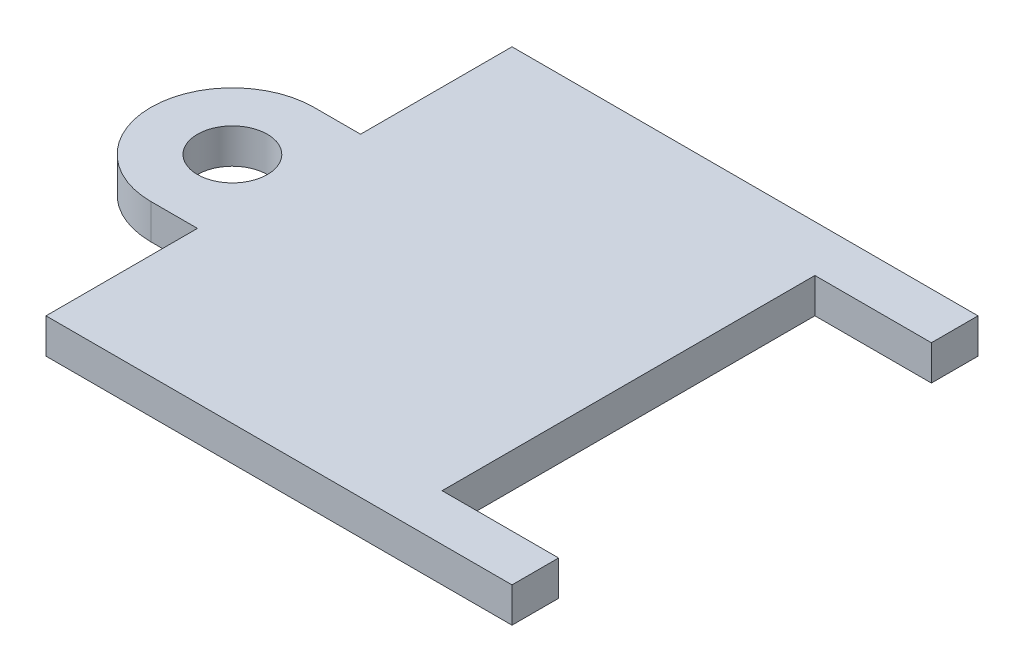
ISO-10303-21;
HEADER;
FILE_DESCRIPTION(('STEP AP214'),'2;1');
FILE_NAME('part.step','',(''),(''),'','','');
FILE_SCHEMA(('AUTOMOTIVE_DESIGN { 1 0 10303 214 1 1 1 1 }'));
ENDSEC;
DATA;
#1=APPLICATION_CONTEXT('core data for automotive mechanical design processes');
#2=APPLICATION_PROTOCOL_DEFINITION('international standard','automotive_design',2000,#1);
#3=PRODUCT_CONTEXT('',#1,'mechanical');
#4=PRODUCT('Part','Part','',(#3));
#5=PRODUCT_RELATED_PRODUCT_CATEGORY('part','',(#4));
#6=PRODUCT_DEFINITION_FORMATION('','',#4);
#7=PRODUCT_DEFINITION_CONTEXT('part definition',#1,'design');
#8=PRODUCT_DEFINITION('design','',#6,#7);
#9=PRODUCT_DEFINITION_SHAPE('','',#8);
#10=(LENGTH_UNIT() NAMED_UNIT(*) SI_UNIT(.MILLI.,.METRE.));
#11=(NAMED_UNIT(*) PLANE_ANGLE_UNIT() SI_UNIT($,.RADIAN.));
#12=(NAMED_UNIT(*) SI_UNIT($,.STERADIAN.) SOLID_ANGLE_UNIT());
#13=UNCERTAINTY_MEASURE_WITH_UNIT(LENGTH_MEASURE(1.E-05),#10,'distance_accuracy_value','');
#14=(GEOMETRIC_REPRESENTATION_CONTEXT(3) GLOBAL_UNCERTAINTY_ASSIGNED_CONTEXT((#13)) GLOBAL_UNIT_ASSIGNED_CONTEXT((#10,
#11,#12)) REPRESENTATION_CONTEXT('',''));
#15=CARTESIAN_POINT('',(0.,0.,0.));
#16=DIRECTION('',(0.,0.,1.));
#17=DIRECTION('',(1.,0.,0.));
#18=AXIS2_PLACEMENT_3D('',#15,#16,#17);
#19=CARTESIAN_POINT('',(-2.,0.,-10.));
#20=DIRECTION('',(0.,1.,0.));
#21=DIRECTION('',(0.,0.,1.));
#22=AXIS2_PLACEMENT_3D('',#19,#20,#21);
#23=PLANE('',#22);
#24=CARTESIAN_POINT('',(-2.,0.,-10.));
#25=DIRECTION('',(0.,1.,0.));
#26=DIRECTION('',(0.,0.,1.));
#27=AXIS2_PLACEMENT_3D('',#24,#25,#26);
#28=CIRCLE('',#27,1.5);
#29=CARTESIAN_POINT('',(-2.,0.,-8.5));
#30=VERTEX_POINT('',#29);
#31=EDGE_CURVE('E176',#30,#30,#28,.T.);
#32=ORIENTED_EDGE('',*,*,#31,.T.);
#33=EDGE_LOOP('',(#32));
#34=FACE_BOUND('',#33,.T.);
#35=DIRECTION('',(0.,0.,1.));
#36=VECTOR('',#35,1.);
#37=CARTESIAN_POINT('',(0.,0.,0.));
#38=LINE('',#37,#36);
#39=CARTESIAN_POINT('',(0.,0.,-6.5));
#40=VERTEX_POINT('',#39);
#41=CARTESIAN_POINT('',(0.,0.,0.));
#42=VERTEX_POINT('',#41);
#43=EDGE_CURVE('E189',#40,#42,#38,.T.);
#44=ORIENTED_EDGE('',*,*,#43,.F.);
#45=DIRECTION('',(1.,0.,0.));
#46=VECTOR('',#45,1.);
#47=CARTESIAN_POINT('',(-2.,0.,-6.5));
#48=LINE('',#47,#46);
#49=CARTESIAN_POINT('',(-2.,0.,-6.5));
#50=VERTEX_POINT('',#49);
#51=EDGE_CURVE('E196',#50,#40,#48,.T.);
#52=ORIENTED_EDGE('',*,*,#51,.F.);
#53=CARTESIAN_POINT('',(-2.,0.,-10.));
#54=DIRECTION('',(0.,1.,0.));
#55=DIRECTION('',(0.,0.,1.));
#56=AXIS2_PLACEMENT_3D('',#53,#54,#55);
#57=CIRCLE('',#56,3.5);
#58=CARTESIAN_POINT('',(-2.,0.,-13.5));
#59=VERTEX_POINT('',#58);
#60=EDGE_CURVE('E261',#59,#50,#57,.T.);
#61=ORIENTED_EDGE('',*,*,#60,.F.);
#62=DIRECTION('',(-1.,0.,0.));
#63=VECTOR('',#62,1.);
#64=CARTESIAN_POINT('',(-2.,0.,-13.5));
#65=LINE('',#64,#63);
#66=CARTESIAN_POINT('',(0.,0.,-13.5));
#67=VERTEX_POINT('',#66);
#68=EDGE_CURVE('E258',#67,#59,#65,.T.);
#69=ORIENTED_EDGE('',*,*,#68,.F.);
#70=DIRECTION('',(0.,0.,1.));
#71=VECTOR('',#70,1.);
#72=CARTESIAN_POINT('',(0.,0.,-13.5));
#73=LINE('',#72,#71);
#74=CARTESIAN_POINT('',(0.,0.,-20.));
#75=VERTEX_POINT('',#74);
#76=EDGE_CURVE('E255',#75,#67,#73,.T.);
#77=ORIENTED_EDGE('',*,*,#76,.F.);
#78=DIRECTION('',(-1.,0.,0.));
#79=VECTOR('',#78,1.);
#80=CARTESIAN_POINT('',(0.,0.,-20.));
#81=LINE('',#80,#79);
#82=CARTESIAN_POINT('',(20.,0.,-20.));
#83=VERTEX_POINT('',#82);
#84=EDGE_CURVE('E252',#83,#75,#81,.T.);
#85=ORIENTED_EDGE('',*,*,#84,.F.);
#86=DIRECTION('',(0.,0.,-1.));
#87=VECTOR('',#86,1.);
#88=CARTESIAN_POINT('',(20.,0.,-20.));
#89=LINE('',#88,#87);
#90=CARTESIAN_POINT('',(20.,0.,-18.));
#91=VERTEX_POINT('',#90);
#92=EDGE_CURVE('E248',#91,#83,#89,.T.);
#93=ORIENTED_EDGE('',*,*,#92,.F.);
#94=DIRECTION('',(1.,0.,0.));
#95=VECTOR('',#94,1.);
#96=CARTESIAN_POINT('',(20.,0.,-18.));
#97=LINE('',#96,#95);
#98=CARTESIAN_POINT('',(15.,0.,-18.));
#99=VERTEX_POINT('',#98);
#100=EDGE_CURVE('E245',#99,#91,#97,.T.);
#101=ORIENTED_EDGE('',*,*,#100,.F.);
#102=DIRECTION('',(0.,0.,-1.));
#103=VECTOR('',#102,1.);
#104=CARTESIAN_POINT('',(15.,0.,-18.));
#105=LINE('',#104,#103);
#106=CARTESIAN_POINT('',(15.,0.,-2.));
#107=VERTEX_POINT('',#106);
#108=EDGE_CURVE('E242',#107,#99,#105,.T.);
#109=ORIENTED_EDGE('',*,*,#108,.F.);
#110=DIRECTION('',(-1.,0.,0.));
#111=VECTOR('',#110,1.);
#112=CARTESIAN_POINT('',(20.,0.,-2.));
#113=LINE('',#112,#111);
#114=CARTESIAN_POINT('',(20.,0.,-2.));
#115=VERTEX_POINT('',#114);
#116=EDGE_CURVE('E239',#115,#107,#113,.T.);
#117=ORIENTED_EDGE('',*,*,#116,.F.);
#118=DIRECTION('',(0.,0.,-1.));
#119=VECTOR('',#118,1.);
#120=CARTESIAN_POINT('',(20.,0.,0.));
#121=LINE('',#120,#119);
#122=CARTESIAN_POINT('',(20.,0.,0.));
#123=VERTEX_POINT('',#122);
#124=EDGE_CURVE('E236',#123,#115,#121,.T.);
#125=ORIENTED_EDGE('',*,*,#124,.F.);
#126=DIRECTION('',(1.,0.,0.));
#127=VECTOR('',#126,1.);
#128=CARTESIAN_POINT('',(15.,0.,0.));
#129=LINE('',#128,#127);
#130=EDGE_CURVE('E233',#42,#123,#129,.T.);
#131=ORIENTED_EDGE('',*,*,#130,.F.);
#132=EDGE_LOOP('',(#44,#52,#61,#69,#77,#85,#93,#101,#109,#117,#125,#131));
#133=FACE_BOUND('',#132,.T.);
#134=DIRECTION('',(0.,0.,-1.));
#135=VECTOR('',#134,1.);
#136=CARTESIAN_POINT('',(2.2,0.,-2.2));
#137=LINE('',#136,#135);
#138=CARTESIAN_POINT('',(2.2,0.,-2.2));
#139=VERTEX_POINT('',#138);
#140=CARTESIAN_POINT('',(2.2,0.,-17.8));
#141=VERTEX_POINT('',#140);
#142=EDGE_CURVE('E55',#139,#141,#137,.T.);
#143=ORIENTED_EDGE('',*,*,#142,.F.);
#144=DIRECTION('',(-1.,0.,0.));
#145=VECTOR('',#144,1.);
#146=CARTESIAN_POINT('',(2.2,0.,-2.2));
#147=LINE('',#146,#145);
#148=CARTESIAN_POINT('',(12.8,0.,-2.2));
#149=VERTEX_POINT('',#148);
#150=EDGE_CURVE('E59',#149,#139,#147,.T.);
#151=ORIENTED_EDGE('',*,*,#150,.F.);
#152=DIRECTION('',(0.,0.,1.));
#153=VECTOR('',#152,1.);
#154=CARTESIAN_POINT('',(12.8,0.,-2.2));
#155=LINE('',#154,#153);
#156=CARTESIAN_POINT('',(12.8,0.,-17.8));
#157=VERTEX_POINT('',#156);
#158=EDGE_CURVE('E541',#157,#149,#155,.T.);
#159=ORIENTED_EDGE('',*,*,#158,.F.);
#160=DIRECTION('',(1.,0.,0.));
#161=VECTOR('',#160,1.);
#162=CARTESIAN_POINT('',(12.8,0.,-17.8));
#163=LINE('',#162,#161);
#164=EDGE_CURVE('E551',#141,#157,#163,.T.);
#165=ORIENTED_EDGE('',*,*,#164,.F.);
#166=EDGE_LOOP('',(#143,#151,#159,#165));
#167=FACE_BOUND('',#166,.T.);
#168=ADVANCED_FACE('F39',(#34,#133,#167),#23,.F.);
#169=CARTESIAN_POINT('',(-2.,1.5,-10.));
#170=DIRECTION('',(0.,1.,0.));
#171=DIRECTION('',(0.,0.,1.));
#172=AXIS2_PLACEMENT_3D('',#169,#170,#171);
#173=PLANE('',#172);
#174=DIRECTION('',(0.,0.,1.));
#175=VECTOR('',#174,1.);
#176=CARTESIAN_POINT('',(0.,1.5,0.));
#177=LINE('',#176,#175);
#178=CARTESIAN_POINT('',(0.,1.5,-6.5));
#179=VERTEX_POINT('',#178);
#180=CARTESIAN_POINT('',(0.,1.5,0.));
#181=VERTEX_POINT('',#180);
#182=EDGE_CURVE('E191',#179,#181,#177,.T.);
#183=ORIENTED_EDGE('',*,*,#182,.T.);
#184=DIRECTION('',(1.,0.,0.));
#185=VECTOR('',#184,1.);
#186=CARTESIAN_POINT('',(0.,1.5,0.));
#187=LINE('',#186,#185);
#188=CARTESIAN_POINT('',(20.,1.5,0.));
#189=VERTEX_POINT('',#188);
#190=EDGE_CURVE('E195',#181,#189,#187,.T.);
#191=ORIENTED_EDGE('',*,*,#190,.T.);
#192=DIRECTION('',(0.,0.,-1.));
#193=VECTOR('',#192,1.);
#194=CARTESIAN_POINT('',(20.,1.5,0.));
#195=LINE('',#194,#193);
#196=CARTESIAN_POINT('',(20.,1.5,-2.));
#197=VERTEX_POINT('',#196);
#198=EDGE_CURVE('E199',#189,#197,#195,.T.);
#199=ORIENTED_EDGE('',*,*,#198,.T.);
#200=DIRECTION('',(-1.,0.,0.));
#201=VECTOR('',#200,1.);
#202=CARTESIAN_POINT('',(20.,1.5,-2.));
#203=LINE('',#202,#201);
#204=CARTESIAN_POINT('',(15.,1.5,-2.));
#205=VERTEX_POINT('',#204);
#206=EDGE_CURVE('E202',#197,#205,#203,.T.);
#207=ORIENTED_EDGE('',*,*,#206,.T.);
#208=DIRECTION('',(0.,0.,-1.));
#209=VECTOR('',#208,1.);
#210=CARTESIAN_POINT('',(15.,1.5,-18.));
#211=LINE('',#210,#209);
#212=CARTESIAN_POINT('',(15.,1.5,-18.));
#213=VERTEX_POINT('',#212);
#214=EDGE_CURVE('E205',#205,#213,#211,.T.);
#215=ORIENTED_EDGE('',*,*,#214,.T.);
#216=DIRECTION('',(1.,0.,0.));
#217=VECTOR('',#216,1.);
#218=CARTESIAN_POINT('',(20.,1.5,-18.));
#219=LINE('',#218,#217);
#220=CARTESIAN_POINT('',(20.,1.5,-18.));
#221=VERTEX_POINT('',#220);
#222=EDGE_CURVE('E208',#213,#221,#219,.T.);
#223=ORIENTED_EDGE('',*,*,#222,.T.);
#224=DIRECTION('',(0.,0.,-1.));
#225=VECTOR('',#224,1.);
#226=CARTESIAN_POINT('',(20.,1.5,-20.));
#227=LINE('',#226,#225);
#228=CARTESIAN_POINT('',(20.,1.5,-20.));
#229=VERTEX_POINT('',#228);
#230=EDGE_CURVE('E211',#221,#229,#227,.T.);
#231=ORIENTED_EDGE('',*,*,#230,.T.);
#232=DIRECTION('',(-1.,0.,0.));
#233=VECTOR('',#232,1.);
#234=CARTESIAN_POINT('',(15.,1.5,-20.));
#235=LINE('',#234,#233);
#236=CARTESIAN_POINT('',(0.,1.5,-20.));
#237=VERTEX_POINT('',#236);
#238=EDGE_CURVE('E214',#229,#237,#235,.T.);
#239=ORIENTED_EDGE('',*,*,#238,.T.);
#240=DIRECTION('',(0.,0.,1.));
#241=VECTOR('',#240,1.);
#242=CARTESIAN_POINT('',(0.,1.5,-13.5));
#243=LINE('',#242,#241);
#244=CARTESIAN_POINT('',(0.,1.5,-13.5));
#245=VERTEX_POINT('',#244);
#246=EDGE_CURVE('E217',#237,#245,#243,.T.);
#247=ORIENTED_EDGE('',*,*,#246,.T.);
#248=DIRECTION('',(-1.,0.,0.));
#249=VECTOR('',#248,1.);
#250=CARTESIAN_POINT('',(-2.,1.5,-13.5));
#251=LINE('',#250,#249);
#252=CARTESIAN_POINT('',(-2.,1.5,-13.5));
#253=VERTEX_POINT('',#252);
#254=EDGE_CURVE('E220',#245,#253,#251,.T.);
#255=ORIENTED_EDGE('',*,*,#254,.T.);
#256=CARTESIAN_POINT('',(-2.,1.5,-10.));
#257=DIRECTION('',(0.,1.,0.));
#258=DIRECTION('',(0.,0.,1.));
#259=AXIS2_PLACEMENT_3D('',#256,#257,#258);
#260=CIRCLE('',#259,3.5);
#261=CARTESIAN_POINT('',(-2.,1.5,-6.5));
#262=VERTEX_POINT('',#261);
#263=EDGE_CURVE('E223',#253,#262,#260,.T.);
#264=ORIENTED_EDGE('',*,*,#263,.T.);
#265=DIRECTION('',(1.,0.,0.));
#266=VECTOR('',#265,1.);
#267=CARTESIAN_POINT('',(-2.,1.5,-6.5));
#268=LINE('',#267,#266);
#269=EDGE_CURVE('E226',#262,#179,#268,.T.);
#270=ORIENTED_EDGE('',*,*,#269,.T.);
#271=EDGE_LOOP('',(#183,#191,#199,#207,#215,#223,#231,#239,#247,#255,#264,#270));
#272=FACE_BOUND('',#271,.T.);
#273=CARTESIAN_POINT('',(-2.,1.5,-10.));
#274=DIRECTION('',(0.,1.,0.));
#275=DIRECTION('',(0.,0.,1.));
#276=AXIS2_PLACEMENT_3D('',#273,#274,#275);
#277=CIRCLE('',#276,1.5);
#278=CARTESIAN_POINT('',(-2.,1.5,-8.5));
#279=VERTEX_POINT('',#278);
#280=EDGE_CURVE('E181',#279,#279,#277,.T.);
#281=ORIENTED_EDGE('',*,*,#280,.F.);
#282=EDGE_LOOP('',(#281));
#283=FACE_BOUND('',#282,.T.);
#284=ADVANCED_FACE('F328',(#272,#283),#173,.T.);
#285=CARTESIAN_POINT('',(0.,1.5,0.));
#286=DIRECTION('',(1.,0.,0.));
#287=DIRECTION('',(0.,0.,-1.));
#288=AXIS2_PLACEMENT_3D('',#285,#286,#287);
#289=PLANE('',#288);
#290=ORIENTED_EDGE('',*,*,#43,.T.);
#291=DIRECTION('',(0.,-1.,0.));
#292=VECTOR('',#291,1.);
#293=CARTESIAN_POINT('',(0.,1.5,0.));
#294=LINE('',#293,#292);
#295=EDGE_CURVE('E11',#181,#42,#294,.T.);
#296=ORIENTED_EDGE('',*,*,#295,.F.);
#297=ORIENTED_EDGE('',*,*,#182,.F.);
#298=DIRECTION('',(0.,-1.,0.));
#299=VECTOR('',#298,1.);
#300=CARTESIAN_POINT('',(0.,1.5,-6.5));
#301=LINE('',#300,#299);
#302=EDGE_CURVE('E229',#179,#40,#301,.T.);
#303=ORIENTED_EDGE('',*,*,#302,.T.);
#304=EDGE_LOOP('',(#290,#296,#297,#303));
#305=FACE_BOUND('',#304,.T.);
#306=ADVANCED_FACE('F41',(#305),#289,.F.);
#307=CARTESIAN_POINT('',(15.,1.5,0.));
#308=DIRECTION('',(0.,0.,-1.));
#309=DIRECTION('',(-1.,0.,0.));
#310=AXIS2_PLACEMENT_3D('',#307,#308,#309);
#311=PLANE('',#310);
#312=ORIENTED_EDGE('',*,*,#130,.T.);
#313=DIRECTION('',(0.,-1.,0.));
#314=VECTOR('',#313,1.);
#315=CARTESIAN_POINT('',(20.,1.5,0.));
#316=LINE('',#315,#314);
#317=EDGE_CURVE('E48',#189,#123,#316,.T.);
#318=ORIENTED_EDGE('',*,*,#317,.F.);
#319=ORIENTED_EDGE('',*,*,#190,.F.);
#320=ORIENTED_EDGE('',*,*,#295,.T.);
#321=EDGE_LOOP('',(#312,#318,#319,#320));
#322=FACE_BOUND('',#321,.T.);
#323=ADVANCED_FACE('F333',(#322),#311,.F.);
#324=CARTESIAN_POINT('',(20.,1.5,0.));
#325=DIRECTION('',(-1.,0.,0.));
#326=DIRECTION('',(0.,0.,1.));
#327=AXIS2_PLACEMENT_3D('',#324,#325,#326);
#328=PLANE('',#327);
#329=ORIENTED_EDGE('',*,*,#124,.T.);
#330=DIRECTION('',(0.,-1.,0.));
#331=VECTOR('',#330,1.);
#332=CARTESIAN_POINT('',(20.,1.5,-2.));
#333=LINE('',#332,#331);
#334=EDGE_CURVE('E301',#197,#115,#333,.T.);
#335=ORIENTED_EDGE('',*,*,#334,.F.);
#336=ORIENTED_EDGE('',*,*,#198,.F.);
#337=ORIENTED_EDGE('',*,*,#317,.T.);
#338=EDGE_LOOP('',(#329,#335,#336,#337));
#339=FACE_BOUND('',#338,.T.);
#340=ADVANCED_FACE('F310',(#339),#328,.F.);
#341=CARTESIAN_POINT('',(20.,1.5,-2.));
#342=DIRECTION('',(0.,0.,1.));
#343=DIRECTION('',(1.,0.,0.));
#344=AXIS2_PLACEMENT_3D('',#341,#342,#343);
#345=PLANE('',#344);
#346=ORIENTED_EDGE('',*,*,#116,.T.);
#347=DIRECTION('',(0.,-1.,0.));
#348=VECTOR('',#347,1.);
#349=CARTESIAN_POINT('',(15.,1.5,-2.));
#350=LINE('',#349,#348);
#351=EDGE_CURVE('E297',#205,#107,#350,.T.);
#352=ORIENTED_EDGE('',*,*,#351,.F.);
#353=ORIENTED_EDGE('',*,*,#206,.F.);
#354=ORIENTED_EDGE('',*,*,#334,.T.);
#355=EDGE_LOOP('',(#346,#352,#353,#354));
#356=FACE_BOUND('',#355,.T.);
#357=ADVANCED_FACE('F320',(#356),#345,.F.);
#358=CARTESIAN_POINT('',(15.,1.5,-18.));
#359=DIRECTION('',(-1.,0.,0.));
#360=DIRECTION('',(0.,0.,1.));
#361=AXIS2_PLACEMENT_3D('',#358,#359,#360);
#362=PLANE('',#361);
#363=ORIENTED_EDGE('',*,*,#108,.T.);
#364=DIRECTION('',(0.,-1.,0.));
#365=VECTOR('',#364,1.);
#366=CARTESIAN_POINT('',(15.,1.5,-18.));
#367=LINE('',#366,#365);
#368=EDGE_CURVE('E293',#213,#99,#367,.T.);
#369=ORIENTED_EDGE('',*,*,#368,.F.);
#370=ORIENTED_EDGE('',*,*,#214,.F.);
#371=ORIENTED_EDGE('',*,*,#351,.T.);
#372=EDGE_LOOP('',(#363,#369,#370,#371));
#373=FACE_BOUND('',#372,.T.);
#374=ADVANCED_FACE('F324',(#373),#362,.F.);
#375=CARTESIAN_POINT('',(20.,1.5,-18.));
#376=DIRECTION('',(0.,0.,-1.));
#377=DIRECTION('',(-1.,0.,0.));
#378=AXIS2_PLACEMENT_3D('',#375,#376,#377);
#379=PLANE('',#378);
#380=ORIENTED_EDGE('',*,*,#100,.T.);
#381=DIRECTION('',(0.,-1.,0.));
#382=VECTOR('',#381,1.);
#383=CARTESIAN_POINT('',(20.,1.5,-18.));
#384=LINE('',#383,#382);
#385=EDGE_CURVE('E289',#221,#91,#384,.T.);
#386=ORIENTED_EDGE('',*,*,#385,.F.);
#387=ORIENTED_EDGE('',*,*,#222,.F.);
#388=ORIENTED_EDGE('',*,*,#368,.T.);
#389=EDGE_LOOP('',(#380,#386,#387,#388));
#390=FACE_BOUND('',#389,.T.);
#391=ADVANCED_FACE('F365',(#390),#379,.F.);
#392=CARTESIAN_POINT('',(20.,1.5,-20.));
#393=DIRECTION('',(-1.,0.,0.));
#394=DIRECTION('',(0.,0.,1.));
#395=AXIS2_PLACEMENT_3D('',#392,#393,#394);
#396=PLANE('',#395);
#397=ORIENTED_EDGE('',*,*,#92,.T.);
#398=DIRECTION('',(0.,-1.,0.));
#399=VECTOR('',#398,1.);
#400=CARTESIAN_POINT('',(20.,1.5,-20.));
#401=LINE('',#400,#399);
#402=EDGE_CURVE('E285',#229,#83,#401,.T.);
#403=ORIENTED_EDGE('',*,*,#402,.F.);
#404=ORIENTED_EDGE('',*,*,#230,.F.);
#405=ORIENTED_EDGE('',*,*,#385,.T.);
#406=EDGE_LOOP('',(#397,#403,#404,#405));
#407=FACE_BOUND('',#406,.T.);
#408=ADVANCED_FACE('F363',(#407),#396,.F.);
#409=CARTESIAN_POINT('',(0.,1.5,-20.));
#410=DIRECTION('',(0.,0.,1.));
#411=DIRECTION('',(1.,0.,0.));
#412=AXIS2_PLACEMENT_3D('',#409,#410,#411);
#413=PLANE('',#412);
#414=ORIENTED_EDGE('',*,*,#84,.T.);
#415=DIRECTION('',(0.,-1.,0.));
#416=VECTOR('',#415,1.);
#417=CARTESIAN_POINT('',(0.,1.5,-20.));
#418=LINE('',#417,#416);
#419=EDGE_CURVE('E281',#237,#75,#418,.T.);
#420=ORIENTED_EDGE('',*,*,#419,.F.);
#421=ORIENTED_EDGE('',*,*,#238,.F.);
#422=ORIENTED_EDGE('',*,*,#402,.T.);
#423=EDGE_LOOP('',(#414,#420,#421,#422));
#424=FACE_BOUND('',#423,.T.);
#425=ADVANCED_FACE('F359',(#424),#413,.F.);
#426=CARTESIAN_POINT('',(0.,1.5,-13.5));
#427=DIRECTION('',(1.,0.,0.));
#428=DIRECTION('',(0.,0.,-1.));
#429=AXIS2_PLACEMENT_3D('',#426,#427,#428);
#430=PLANE('',#429);
#431=ORIENTED_EDGE('',*,*,#76,.T.);
#432=DIRECTION('',(0.,-1.,0.));
#433=VECTOR('',#432,1.);
#434=CARTESIAN_POINT('',(0.,1.5,-13.5));
#435=LINE('',#434,#433);
#436=EDGE_CURVE('E277',#245,#67,#435,.T.);
#437=ORIENTED_EDGE('',*,*,#436,.F.);
#438=ORIENTED_EDGE('',*,*,#246,.F.);
#439=ORIENTED_EDGE('',*,*,#419,.T.);
#440=EDGE_LOOP('',(#431,#437,#438,#439));
#441=FACE_BOUND('',#440,.T.);
#442=ADVANCED_FACE('F354',(#441),#430,.F.);
#443=CARTESIAN_POINT('',(-2.,1.5,-13.5));
#444=DIRECTION('',(0.,0.,1.));
#445=DIRECTION('',(1.,0.,0.));
#446=AXIS2_PLACEMENT_3D('',#443,#444,#445);
#447=PLANE('',#446);
#448=ORIENTED_EDGE('',*,*,#68,.T.);
#449=DIRECTION('',(0.,-1.,0.));
#450=VECTOR('',#449,1.);
#451=CARTESIAN_POINT('',(-2.,1.5,-13.5));
#452=LINE('',#451,#450);
#453=EDGE_CURVE('E273',#253,#59,#452,.T.);
#454=ORIENTED_EDGE('',*,*,#453,.F.);
#455=ORIENTED_EDGE('',*,*,#254,.F.);
#456=ORIENTED_EDGE('',*,*,#436,.T.);
#457=EDGE_LOOP('',(#448,#454,#455,#456));
#458=FACE_BOUND('',#457,.T.);
#459=ADVANCED_FACE('F349',(#458),#447,.F.);
#460=CARTESIAN_POINT('',(-2.,1.5,-10.));
#461=DIRECTION('',(0.,-1.,0.));
#462=DIRECTION('',(0.,0.,-1.));
#463=AXIS2_PLACEMENT_3D('',#460,#461,#462);
#464=CYLINDRICAL_SURFACE('',#463,3.5);
#465=ORIENTED_EDGE('',*,*,#60,.T.);
#466=DIRECTION('',(0.,-1.,0.));
#467=VECTOR('',#466,1.);
#468=CARTESIAN_POINT('',(-2.,1.5,-6.5));
#469=LINE('',#468,#467);
#470=EDGE_CURVE('E269',#262,#50,#469,.T.);
#471=ORIENTED_EDGE('',*,*,#470,.F.);
#472=ORIENTED_EDGE('',*,*,#263,.F.);
#473=ORIENTED_EDGE('',*,*,#453,.T.);
#474=EDGE_LOOP('',(#465,#471,#472,#473));
#475=FACE_BOUND('',#474,.T.);
#476=ADVANCED_FACE('F345',(#475),#464,.T.);
#477=CARTESIAN_POINT('',(-2.,1.5,-6.5));
#478=DIRECTION('',(0.,0.,-1.));
#479=DIRECTION('',(-1.,0.,0.));
#480=AXIS2_PLACEMENT_3D('',#477,#478,#479);
#481=PLANE('',#480);
#482=ORIENTED_EDGE('',*,*,#51,.T.);
#483=ORIENTED_EDGE('',*,*,#302,.F.);
#484=ORIENTED_EDGE('',*,*,#269,.F.);
#485=ORIENTED_EDGE('',*,*,#470,.T.);
#486=EDGE_LOOP('',(#482,#483,#484,#485));
#487=FACE_BOUND('',#486,.T.);
#488=ADVANCED_FACE('F340',(#487),#481,.F.);
#489=CARTESIAN_POINT('',(-2.,1.5,-10.));
#490=DIRECTION('',(0.,-1.,0.));
#491=DIRECTION('',(0.,0.,-1.));
#492=AXIS2_PLACEMENT_3D('',#489,#490,#491);
#493=CYLINDRICAL_SURFACE('',#492,1.5);
#494=ORIENTED_EDGE('',*,*,#280,.T.);
#495=EDGE_LOOP('',(#494));
#496=FACE_BOUND('',#495,.T.);
#497=ORIENTED_EDGE('',*,*,#31,.F.);
#498=EDGE_LOOP('',(#497));
#499=FACE_BOUND('',#498,.T.);
#500=ADVANCED_FACE('F385',(#496,#499),#493,.F.);
#501=CARTESIAN_POINT('',(2.2,-1.5,-2.2));
#502=DIRECTION('',(1.,0.,0.));
#503=DIRECTION('',(0.,0.,-1.));
#504=AXIS2_PLACEMENT_3D('',#501,#502,#503);
#505=PLANE('',#504);
#506=ORIENTED_EDGE('',*,*,#142,.T.);
#507=DIRECTION('',(0.,1.,0.));
#508=VECTOR('',#507,1.);
#509=CARTESIAN_POINT('',(2.2,-1.5,-17.8));
#510=LINE('',#509,#508);
#511=CARTESIAN_POINT('',(2.2,-1.5,-17.8));
#512=VERTEX_POINT('',#511);
#513=EDGE_CURVE('E156',#512,#141,#510,.T.);
#514=ORIENTED_EDGE('',*,*,#513,.F.);
#515=DIRECTION('',(0.,0.,-1.));
#516=VECTOR('',#515,1.);
#517=CARTESIAN_POINT('',(2.2,-1.5,-2.2));
#518=LINE('',#517,#516);
#519=CARTESIAN_POINT('',(2.2,-1.5,-2.2));
#520=VERTEX_POINT('',#519);
#521=EDGE_CURVE('E163',#520,#512,#518,.T.);
#522=ORIENTED_EDGE('',*,*,#521,.F.);
#523=DIRECTION('',(0.,1.,0.));
#524=VECTOR('',#523,1.);
#525=CARTESIAN_POINT('',(2.2,-1.5,-2.2));
#526=LINE('',#525,#524);
#527=EDGE_CURVE('E538',#520,#139,#526,.T.);
#528=ORIENTED_EDGE('',*,*,#527,.T.);
#529=EDGE_LOOP('',(#506,#514,#522,#528));
#530=FACE_BOUND('',#529,.T.);
#531=ADVANCED_FACE('F174',(#530),#505,.F.);
#532=CARTESIAN_POINT('',(12.8,-1.5,-17.8));
#533=DIRECTION('',(0.,0.,1.));
#534=DIRECTION('',(1.,0.,0.));
#535=AXIS2_PLACEMENT_3D('',#532,#533,#534);
#536=PLANE('',#535);
#537=ORIENTED_EDGE('',*,*,#164,.T.);
#538=DIRECTION('',(0.,1.,0.));
#539=VECTOR('',#538,1.);
#540=CARTESIAN_POINT('',(12.8,-1.5,-17.8));
#541=LINE('',#540,#539);
#542=CARTESIAN_POINT('',(12.8,-1.5,-17.8));
#543=VERTEX_POINT('',#542);
#544=EDGE_CURVE('E158',#543,#157,#541,.T.);
#545=ORIENTED_EDGE('',*,*,#544,.F.);
#546=DIRECTION('',(1.,0.,0.));
#547=VECTOR('',#546,1.);
#548=CARTESIAN_POINT('',(12.8,-1.5,-17.8));
#549=LINE('',#548,#547);
#550=EDGE_CURVE('E151',#512,#543,#549,.T.);
#551=ORIENTED_EDGE('',*,*,#550,.F.);
#552=ORIENTED_EDGE('',*,*,#513,.T.);
#553=EDGE_LOOP('',(#537,#545,#551,#552));
#554=FACE_BOUND('',#553,.T.);
#555=ADVANCED_FACE('F154',(#554),#536,.F.);
#556=CARTESIAN_POINT('',(12.8,-1.5,-2.2));
#557=DIRECTION('',(-1.,0.,0.));
#558=DIRECTION('',(0.,0.,1.));
#559=AXIS2_PLACEMENT_3D('',#556,#557,#558);
#560=PLANE('',#559);
#561=ORIENTED_EDGE('',*,*,#158,.T.);
#562=DIRECTION('',(0.,1.,0.));
#563=VECTOR('',#562,1.);
#564=CARTESIAN_POINT('',(12.8,-1.5,-2.2));
#565=LINE('',#564,#563);
#566=CARTESIAN_POINT('',(12.8,-1.5,-2.2));
#567=VERTEX_POINT('',#566);
#568=EDGE_CURVE('E183',#567,#149,#565,.T.);
#569=ORIENTED_EDGE('',*,*,#568,.F.);
#570=DIRECTION('',(0.,0.,1.));
#571=VECTOR('',#570,1.);
#572=CARTESIAN_POINT('',(12.8,-1.5,-2.2));
#573=LINE('',#572,#571);
#574=EDGE_CURVE('E162',#543,#567,#573,.T.);
#575=ORIENTED_EDGE('',*,*,#574,.F.);
#576=ORIENTED_EDGE('',*,*,#544,.T.);
#577=EDGE_LOOP('',(#561,#569,#575,#576));
#578=FACE_BOUND('',#577,.T.);
#579=ADVANCED_FACE('F431',(#578),#560,.F.);
#580=CARTESIAN_POINT('',(2.2,-1.5,-2.2));
#581=DIRECTION('',(0.,0.,-1.));
#582=DIRECTION('',(-1.,0.,0.));
#583=AXIS2_PLACEMENT_3D('',#580,#581,#582);
#584=PLANE('',#583);
#585=ORIENTED_EDGE('',*,*,#150,.T.);
#586=ORIENTED_EDGE('',*,*,#527,.F.);
#587=DIRECTION('',(-1.,0.,0.));
#588=VECTOR('',#587,1.);
#589=CARTESIAN_POINT('',(2.2,-1.5,-2.2));
#590=LINE('',#589,#588);
#591=EDGE_CURVE('E168',#567,#520,#590,.T.);
#592=ORIENTED_EDGE('',*,*,#591,.F.);
#593=ORIENTED_EDGE('',*,*,#568,.T.);
#594=EDGE_LOOP('',(#585,#586,#592,#593));
#595=FACE_BOUND('',#594,.T.);
#596=ADVANCED_FACE('F438',(#595),#584,.F.);
#597=CARTESIAN_POINT('',(0.,-1.5,0.));
#598=DIRECTION('',(0.,1.,0.));
#599=DIRECTION('',(0.,0.,1.));
#600=AXIS2_PLACEMENT_3D('',#597,#598,#599);
#601=PLANE('',#600);
#602=ORIENTED_EDGE('',*,*,#521,.T.);
#603=ORIENTED_EDGE('',*,*,#550,.T.);
#604=ORIENTED_EDGE('',*,*,#574,.T.);
#605=ORIENTED_EDGE('',*,*,#591,.T.);
#606=EDGE_LOOP('',(#602,#603,#604,#605));
#607=FACE_BOUND('',#606,.T.);
#608=ADVANCED_FACE('F166',(#607),#601,.F.);
#609=CLOSED_SHELL('',(#168,#284,#306,#323,#340,#357,#374,#391,#408,#425,#442,#459,#476,#488,
#500,#531,#555,#579,#596,#608));
#610=MANIFOLD_SOLID_BREP('B2',#609);
#611=ADVANCED_BREP_SHAPE_REPRESENTATION('',(#18,#610),#14);
#612=SHAPE_DEFINITION_REPRESENTATION(#9,#611);
ENDSEC;
END-ISO-10303-21;
